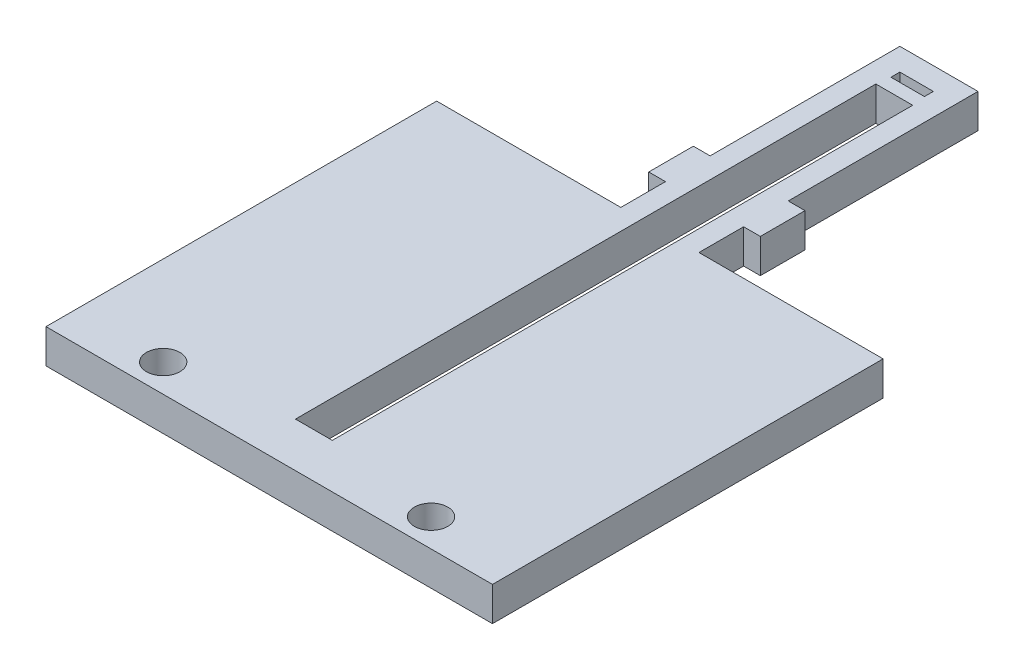
ISO-10303-21;
HEADER;
FILE_DESCRIPTION(('STEP AP214'),'2;1');
FILE_NAME('part.step','',(''),(''),'','','');
FILE_SCHEMA(('AUTOMOTIVE_DESIGN { 1 0 10303 214 1 1 1 1 }'));
ENDSEC;
DATA;
#1=APPLICATION_CONTEXT('core data for automotive mechanical design processes');
#2=APPLICATION_PROTOCOL_DEFINITION('international standard','automotive_design',2000,#1);
#3=PRODUCT_CONTEXT('',#1,'mechanical');
#4=PRODUCT('Part','Part','',(#3));
#5=PRODUCT_RELATED_PRODUCT_CATEGORY('part','',(#4));
#6=PRODUCT_DEFINITION_FORMATION('','',#4);
#7=PRODUCT_DEFINITION_CONTEXT('part definition',#1,'design');
#8=PRODUCT_DEFINITION('design','',#6,#7);
#9=PRODUCT_DEFINITION_SHAPE('','',#8);
#10=(LENGTH_UNIT() NAMED_UNIT(*) SI_UNIT(.MILLI.,.METRE.));
#11=(NAMED_UNIT(*) PLANE_ANGLE_UNIT() SI_UNIT($,.RADIAN.));
#12=(NAMED_UNIT(*) SI_UNIT($,.STERADIAN.) SOLID_ANGLE_UNIT());
#13=UNCERTAINTY_MEASURE_WITH_UNIT(LENGTH_MEASURE(1.E-05),#10,'distance_accuracy_value','');
#14=(GEOMETRIC_REPRESENTATION_CONTEXT(3) GLOBAL_UNCERTAINTY_ASSIGNED_CONTEXT((#13)) GLOBAL_UNIT_ASSIGNED_CONTEXT((#10,
#11,#12)) REPRESENTATION_CONTEXT('',''));
#15=CARTESIAN_POINT('',(0.,0.,0.));
#16=DIRECTION('',(0.,0.,1.));
#17=DIRECTION('',(1.,0.,0.));
#18=AXIS2_PLACEMENT_3D('',#15,#16,#17);
#19=CARTESIAN_POINT('',(0.,3.05,0.));
#20=DIRECTION('',(0.,0.,-1.));
#21=DIRECTION('',(-1.,0.,0.));
#22=AXIS2_PLACEMENT_3D('',#19,#20,#21);
#23=PLANE('',#22);
#24=DIRECTION('',(1.,0.,0.));
#25=VECTOR('',#24,1.);
#26=CARTESIAN_POINT('',(0.,0.,0.));
#27=LINE('',#26,#25);
#28=CARTESIAN_POINT('',(0.,0.,0.));
#29=VERTEX_POINT('',#28);
#30=CARTESIAN_POINT('',(40.,0.,0.));
#31=VERTEX_POINT('',#30);
#32=EDGE_CURVE('E239',#29,#31,#27,.T.);
#33=ORIENTED_EDGE('',*,*,#32,.T.);
#34=DIRECTION('',(0.,-1.,0.));
#35=VECTOR('',#34,1.);
#36=CARTESIAN_POINT('',(40.,3.05,0.));
#37=LINE('',#36,#35);
#38=CARTESIAN_POINT('',(40.,3.05,0.));
#39=VERTEX_POINT('',#38);
#40=EDGE_CURVE('E232',#39,#31,#37,.T.);
#41=ORIENTED_EDGE('',*,*,#40,.F.);
#42=DIRECTION('',(1.,0.,0.));
#43=VECTOR('',#42,1.);
#44=CARTESIAN_POINT('',(0.,3.05,0.));
#45=LINE('',#44,#43);
#46=CARTESIAN_POINT('',(0.,3.05,0.));
#47=VERTEX_POINT('',#46);
#48=EDGE_CURVE('E250',#47,#39,#45,.T.);
#49=ORIENTED_EDGE('',*,*,#48,.F.);
#50=DIRECTION('',(0.,-1.,0.));
#51=VECTOR('',#50,1.);
#52=CARTESIAN_POINT('',(0.,3.05,0.));
#53=LINE('',#52,#51);
#54=EDGE_CURVE('E228',#47,#29,#53,.T.);
#55=ORIENTED_EDGE('',*,*,#54,.T.);
#56=EDGE_LOOP('',(#33,#41,#49,#55));
#57=FACE_BOUND('',#56,.T.);
#58=ADVANCED_FACE('F42',(#57),#23,.F.);
#59=CARTESIAN_POINT('',(40.,3.05,0.));
#60=DIRECTION('',(-1.,0.,0.));
#61=DIRECTION('',(0.,0.,1.));
#62=AXIS2_PLACEMENT_3D('',#59,#60,#61);
#63=PLANE('',#62);
#64=DIRECTION('',(0.,0.,-1.));
#65=VECTOR('',#64,1.);
#66=CARTESIAN_POINT('',(40.,0.,0.));
#67=LINE('',#66,#65);
#68=CARTESIAN_POINT('',(40.,0.,-35.));
#69=VERTEX_POINT('',#68);
#70=EDGE_CURVE('E242',#31,#69,#67,.T.);
#71=ORIENTED_EDGE('',*,*,#70,.T.);
#72=DIRECTION('',(0.,1.,0.));
#73=VECTOR('',#72,1.);
#74=CARTESIAN_POINT('',(40.,-6.95,-35.));
#75=LINE('',#74,#73);
#76=CARTESIAN_POINT('',(40.,3.05,-35.));
#77=VERTEX_POINT('',#76);
#78=EDGE_CURVE('E313',#69,#77,#75,.T.);
#79=ORIENTED_EDGE('',*,*,#78,.T.);
#80=DIRECTION('',(0.,0.,-1.));
#81=VECTOR('',#80,1.);
#82=CARTESIAN_POINT('',(40.,3.05,0.));
#83=LINE('',#82,#81);
#84=EDGE_CURVE('E235',#39,#77,#83,.T.);
#85=ORIENTED_EDGE('',*,*,#84,.F.);
#86=ORIENTED_EDGE('',*,*,#40,.T.);
#87=EDGE_LOOP('',(#71,#79,#85,#86));
#88=FACE_BOUND('',#87,.T.);
#89=ADVANCED_FACE('F417',(#88),#63,.F.);
#90=CARTESIAN_POINT('',(0.,3.05,-60.));
#91=DIRECTION('',(0.,0.,-1.));
#92=DIRECTION('',(-1.,0.,0.));
#93=AXIS2_PLACEMENT_3D('',#90,#91,#92);
#94=PLANE('',#93);
#95=DIRECTION('',(0.,1.,0.));
#96=VECTOR('',#95,1.);
#97=CARTESIAN_POINT('',(16.5,-6.95,-60.));
#98=LINE('',#97,#96);
#99=CARTESIAN_POINT('',(16.5,0.,-60.));
#100=VERTEX_POINT('',#99);
#101=CARTESIAN_POINT('',(16.5,3.05,-60.));
#102=VERTEX_POINT('',#101);
#103=EDGE_CURVE('E333',#100,#102,#98,.T.);
#104=ORIENTED_EDGE('',*,*,#103,.T.);
#105=DIRECTION('',(1.,0.,0.));
#106=VECTOR('',#105,1.);
#107=CARTESIAN_POINT('',(0.,3.05,-60.));
#108=LINE('',#107,#106);
#109=CARTESIAN_POINT('',(23.5,3.05,-60.));
#110=VERTEX_POINT('',#109);
#111=EDGE_CURVE('E230',#102,#110,#108,.T.);
#112=ORIENTED_EDGE('',*,*,#111,.T.);
#113=DIRECTION('',(0.,1.,0.));
#114=VECTOR('',#113,1.);
#115=CARTESIAN_POINT('',(23.5,-6.95,-60.));
#116=LINE('',#115,#114);
#117=CARTESIAN_POINT('',(23.5,0.,-60.));
#118=VERTEX_POINT('',#117);
#119=EDGE_CURVE('E346',#118,#110,#116,.T.);
#120=ORIENTED_EDGE('',*,*,#119,.F.);
#121=DIRECTION('',(1.,0.,0.));
#122=VECTOR('',#121,1.);
#123=CARTESIAN_POINT('',(0.,0.,-60.));
#124=LINE('',#123,#122);
#125=EDGE_CURVE('E246',#100,#118,#124,.T.);
#126=ORIENTED_EDGE('',*,*,#125,.F.);
#127=EDGE_LOOP('',(#104,#112,#120,#126));
#128=FACE_BOUND('',#127,.T.);
#129=ADVANCED_FACE('F443',(#128),#94,.T.);
#130=CARTESIAN_POINT('',(0.,3.05,0.));
#131=DIRECTION('',(-1.,0.,0.));
#132=DIRECTION('',(0.,0.,1.));
#133=AXIS2_PLACEMENT_3D('',#130,#131,#132);
#134=PLANE('',#133);
#135=DIRECTION('',(0.,1.,0.));
#136=VECTOR('',#135,1.);
#137=CARTESIAN_POINT('',(0.,-6.95,-35.));
#138=LINE('',#137,#136);
#139=CARTESIAN_POINT('',(0.,0.,-35.));
#140=VERTEX_POINT('',#139);
#141=CARTESIAN_POINT('',(0.,3.05,-35.));
#142=VERTEX_POINT('',#141);
#143=EDGE_CURVE('E202',#140,#142,#138,.T.);
#144=ORIENTED_EDGE('',*,*,#143,.F.);
#145=DIRECTION('',(0.,0.,-1.));
#146=VECTOR('',#145,1.);
#147=CARTESIAN_POINT('',(0.,0.,0.));
#148=LINE('',#147,#146);
#149=EDGE_CURVE('E249',#29,#140,#148,.T.);
#150=ORIENTED_EDGE('',*,*,#149,.F.);
#151=ORIENTED_EDGE('',*,*,#54,.F.);
#152=DIRECTION('',(0.,0.,-1.));
#153=VECTOR('',#152,1.);
#154=CARTESIAN_POINT('',(0.,3.05,0.));
#155=LINE('',#154,#153);
#156=EDGE_CURVE('E221',#47,#142,#155,.T.);
#157=ORIENTED_EDGE('',*,*,#156,.T.);
#158=EDGE_LOOP('',(#144,#150,#151,#157));
#159=FACE_BOUND('',#158,.T.);
#160=ADVANCED_FACE('F227',(#159),#134,.T.);
#161=CARTESIAN_POINT('',(0.,3.05,0.));
#162=DIRECTION('',(0.,1.,0.));
#163=DIRECTION('',(0.,0.,1.));
#164=AXIS2_PLACEMENT_3D('',#161,#162,#163);
#165=PLANE('',#164);
#166=CARTESIAN_POINT('',(8.,3.05,-2.5));
#167=DIRECTION('',(0.,1.,0.));
#168=DIRECTION('',(0.,0.,1.));
#169=AXIS2_PLACEMENT_3D('',#166,#167,#168);
#170=CIRCLE('',#169,1.5);
#171=CARTESIAN_POINT('',(8.,3.05,-1.));
#172=VERTEX_POINT('',#171);
#173=EDGE_CURVE('E309',#172,#172,#170,.T.);
#174=ORIENTED_EDGE('',*,*,#173,.F.);
#175=EDGE_LOOP('',(#174));
#176=FACE_BOUND('',#175,.T.);
#177=CARTESIAN_POINT('',(32.,3.05,-2.5));
#178=DIRECTION('',(0.,1.,0.));
#179=DIRECTION('',(0.,0.,1.));
#180=AXIS2_PLACEMENT_3D('',#177,#178,#179);
#181=CIRCLE('',#180,1.5);
#182=CARTESIAN_POINT('',(32.,3.05,-0.999999999999996));
#183=VERTEX_POINT('',#182);
#184=EDGE_CURVE('E315',#183,#183,#181,.T.);
#185=ORIENTED_EDGE('',*,*,#184,.F.);
#186=EDGE_LOOP('',(#185));
#187=FACE_BOUND('',#186,.T.);
#188=DIRECTION('',(0.,0.,-1.));
#189=VECTOR('',#188,1.);
#190=CARTESIAN_POINT('',(16.5,3.05,-43.));
#191=LINE('',#190,#189);
#192=CARTESIAN_POINT('',(16.5,3.05,-43.));
#193=VERTEX_POINT('',#192);
#194=EDGE_CURVE('E213',#193,#102,#191,.T.);
#195=ORIENTED_EDGE('',*,*,#194,.F.);
#196=DIRECTION('',(1.,0.,0.));
#197=VECTOR('',#196,1.);
#198=CARTESIAN_POINT('',(15.,3.05,-43.));
#199=LINE('',#198,#197);
#200=CARTESIAN_POINT('',(15.,3.05,-43.));
#201=VERTEX_POINT('',#200);
#202=EDGE_CURVE('E329',#201,#193,#199,.T.);
#203=ORIENTED_EDGE('',*,*,#202,.F.);
#204=DIRECTION('',(0.,0.,-1.));
#205=VECTOR('',#204,1.);
#206=CARTESIAN_POINT('',(15.,3.05,-39.));
#207=LINE('',#206,#205);
#208=CARTESIAN_POINT('',(15.,3.05,-39.));
#209=VERTEX_POINT('',#208);
#210=EDGE_CURVE('E326',#209,#201,#207,.T.);
#211=ORIENTED_EDGE('',*,*,#210,.F.);
#212=DIRECTION('',(-1.,0.,0.));
#213=VECTOR('',#212,1.);
#214=CARTESIAN_POINT('',(16.5,3.05,-39.));
#215=LINE('',#214,#213);
#216=CARTESIAN_POINT('',(16.5,3.05,-39.));
#217=VERTEX_POINT('',#216);
#218=EDGE_CURVE('E323',#217,#209,#215,.T.);
#219=ORIENTED_EDGE('',*,*,#218,.F.);
#220=DIRECTION('',(0.,0.,-1.));
#221=VECTOR('',#220,1.);
#222=CARTESIAN_POINT('',(16.5,3.05,-35.));
#223=LINE('',#222,#221);
#224=CARTESIAN_POINT('',(16.5,3.05,-35.));
#225=VERTEX_POINT('',#224);
#226=EDGE_CURVE('E224',#225,#217,#223,.T.);
#227=ORIENTED_EDGE('',*,*,#226,.F.);
#228=DIRECTION('',(1.,0.,0.));
#229=VECTOR('',#228,1.);
#230=CARTESIAN_POINT('',(0.,3.05,-35.));
#231=LINE('',#230,#229);
#232=EDGE_CURVE('E205',#142,#225,#231,.T.);
#233=ORIENTED_EDGE('',*,*,#232,.F.);
#234=ORIENTED_EDGE('',*,*,#156,.F.);
#235=ORIENTED_EDGE('',*,*,#48,.T.);
#236=ORIENTED_EDGE('',*,*,#84,.T.);
#237=DIRECTION('',(1.,0.,0.));
#238=VECTOR('',#237,1.);
#239=CARTESIAN_POINT('',(23.5,3.05,-35.));
#240=LINE('',#239,#238);
#241=CARTESIAN_POINT('',(23.5,3.05,-35.));
#242=VERTEX_POINT('',#241);
#243=EDGE_CURVE('E348',#242,#77,#240,.T.);
#244=ORIENTED_EDGE('',*,*,#243,.F.);
#245=DIRECTION('',(0.,0.,1.));
#246=VECTOR('',#245,1.);
#247=CARTESIAN_POINT('',(23.5,3.05,-35.));
#248=LINE('',#247,#246);
#249=CARTESIAN_POINT('',(23.5,3.05,-39.));
#250=VERTEX_POINT('',#249);
#251=EDGE_CURVE('E361',#250,#242,#248,.T.);
#252=ORIENTED_EDGE('',*,*,#251,.F.);
#253=DIRECTION('',(-1.,0.,0.));
#254=VECTOR('',#253,1.);
#255=CARTESIAN_POINT('',(23.5,3.05,-39.));
#256=LINE('',#255,#254);
#257=CARTESIAN_POINT('',(25.,3.05,-39.));
#258=VERTEX_POINT('',#257);
#259=EDGE_CURVE('E364',#258,#250,#256,.T.);
#260=ORIENTED_EDGE('',*,*,#259,.F.);
#261=DIRECTION('',(0.,0.,1.));
#262=VECTOR('',#261,1.);
#263=CARTESIAN_POINT('',(25.,3.05,-39.));
#264=LINE('',#263,#262);
#265=CARTESIAN_POINT('',(25.,3.05,-43.));
#266=VERTEX_POINT('',#265);
#267=EDGE_CURVE('E367',#266,#258,#264,.T.);
#268=ORIENTED_EDGE('',*,*,#267,.F.);
#269=DIRECTION('',(1.,0.,0.));
#270=VECTOR('',#269,1.);
#271=CARTESIAN_POINT('',(25.,3.05,-43.));
#272=LINE('',#271,#270);
#273=CARTESIAN_POINT('',(23.5,3.05,-43.));
#274=VERTEX_POINT('',#273);
#275=EDGE_CURVE('E370',#274,#266,#272,.T.);
#276=ORIENTED_EDGE('',*,*,#275,.F.);
#277=DIRECTION('',(0.,0.,1.));
#278=VECTOR('',#277,1.);
#279=CARTESIAN_POINT('',(23.5,3.05,-43.));
#280=LINE('',#279,#278);
#281=EDGE_CURVE('E225',#110,#274,#280,.T.);
#282=ORIENTED_EDGE('',*,*,#281,.F.);
#283=ORIENTED_EDGE('',*,*,#111,.F.);
#284=EDGE_LOOP('',(#195,#203,#211,#219,#227,#233,#234,#235,#236,#244,#252,#260,#268,#276,#282,#283));
#285=FACE_BOUND('',#284,.T.);
#286=DIRECTION('',(1.,0.,0.));
#287=VECTOR('',#286,1.);
#288=CARTESIAN_POINT('',(0.,3.05,-4.));
#289=LINE('',#288,#287);
#290=CARTESIAN_POINT('',(18.35,3.05,-4.));
#291=VERTEX_POINT('',#290);
#292=CARTESIAN_POINT('',(21.65,3.05,-4.));
#293=VERTEX_POINT('',#292);
#294=EDGE_CURVE('E374',#291,#293,#289,.T.);
#295=ORIENTED_EDGE('',*,*,#294,.F.);
#296=DIRECTION('',(0.,0.,1.));
#297=VECTOR('',#296,1.);
#298=CARTESIAN_POINT('',(18.35,3.05,0.));
#299=LINE('',#298,#297);
#300=CARTESIAN_POINT('',(18.35,3.05,-56.));
#301=VERTEX_POINT('',#300);
#302=EDGE_CURVE('E383',#301,#291,#299,.T.);
#303=ORIENTED_EDGE('',*,*,#302,.F.);
#304=DIRECTION('',(-1.,0.,0.));
#305=VECTOR('',#304,1.);
#306=CARTESIAN_POINT('',(0.,3.05,-56.));
#307=LINE('',#306,#305);
#308=CARTESIAN_POINT('',(21.65,3.05,-56.));
#309=VERTEX_POINT('',#308);
#310=EDGE_CURVE('E380',#309,#301,#307,.T.);
#311=ORIENTED_EDGE('',*,*,#310,.F.);
#312=DIRECTION('',(0.,0.,-1.));
#313=VECTOR('',#312,1.);
#314=CARTESIAN_POINT('',(21.65,3.05,0.));
#315=LINE('',#314,#313);
#316=EDGE_CURVE('E376',#293,#309,#315,.T.);
#317=ORIENTED_EDGE('',*,*,#316,.F.);
#318=EDGE_LOOP('',(#295,#303,#311,#317));
#319=FACE_BOUND('',#318,.T.);
#320=DIRECTION('',(1.,0.,0.));
#321=VECTOR('',#320,1.);
#322=CARTESIAN_POINT('',(0.,3.05,-57.2));
#323=LINE('',#322,#321);
#324=CARTESIAN_POINT('',(18.5,3.05,-57.2));
#325=VERTEX_POINT('',#324);
#326=CARTESIAN_POINT('',(21.5,3.05,-57.2));
#327=VERTEX_POINT('',#326);
#328=EDGE_CURVE('E336',#325,#327,#323,.T.);
#329=ORIENTED_EDGE('',*,*,#328,.F.);
#330=DIRECTION('',(0.,0.,1.));
#331=VECTOR('',#330,1.);
#332=CARTESIAN_POINT('',(18.5000000000003,3.05,0.));
#333=LINE('',#332,#331);
#334=CARTESIAN_POINT('',(18.5,3.05,-58.));
#335=VERTEX_POINT('',#334);
#336=EDGE_CURVE('E401',#335,#325,#333,.T.);
#337=ORIENTED_EDGE('',*,*,#336,.F.);
#338=DIRECTION('',(-1.,0.,0.));
#339=VECTOR('',#338,1.);
#340=CARTESIAN_POINT('',(0.,3.05,-58.));
#341=LINE('',#340,#339);
#342=CARTESIAN_POINT('',(21.5,3.05,-58.));
#343=VERTEX_POINT('',#342);
#344=EDGE_CURVE('E398',#343,#335,#341,.T.);
#345=ORIENTED_EDGE('',*,*,#344,.F.);
#346=DIRECTION('',(0.,0.,-1.));
#347=VECTOR('',#346,1.);
#348=CARTESIAN_POINT('',(21.4999999999995,3.05,1.86482773667502E-13));
#349=LINE('',#348,#347);
#350=EDGE_CURVE('E395',#327,#343,#349,.T.);
#351=ORIENTED_EDGE('',*,*,#350,.F.);
#352=EDGE_LOOP('',(#329,#337,#345,#351));
#353=FACE_BOUND('',#352,.T.);
#354=ADVANCED_FACE('F218',(#176,#187,#285,#319,#353),#165,.T.);
#355=CARTESIAN_POINT('',(0.,0.,0.));
#356=DIRECTION('',(0.,1.,0.));
#357=DIRECTION('',(0.,0.,1.));
#358=AXIS2_PLACEMENT_3D('',#355,#356,#357);
#359=PLANE('',#358);
#360=CARTESIAN_POINT('',(8.,0.,-2.5));
#361=DIRECTION('',(0.,1.,0.));
#362=DIRECTION('',(0.,0.,1.));
#363=AXIS2_PLACEMENT_3D('',#360,#361,#362);
#364=CIRCLE('',#363,1.5);
#365=CARTESIAN_POINT('',(8.,0.,-1.));
#366=VERTEX_POINT('',#365);
#367=EDGE_CURVE('E45',#366,#366,#364,.T.);
#368=ORIENTED_EDGE('',*,*,#367,.T.);
#369=EDGE_LOOP('',(#368));
#370=FACE_BOUND('',#369,.T.);
#371=CARTESIAN_POINT('',(32.,0.,-2.5));
#372=DIRECTION('',(0.,1.,0.));
#373=DIRECTION('',(0.,0.,1.));
#374=AXIS2_PLACEMENT_3D('',#371,#372,#373);
#375=CIRCLE('',#374,1.5);
#376=CARTESIAN_POINT('',(32.,0.,-0.999999999999996));
#377=VERTEX_POINT('',#376);
#378=EDGE_CURVE('E307',#377,#377,#375,.T.);
#379=ORIENTED_EDGE('',*,*,#378,.T.);
#380=EDGE_LOOP('',(#379));
#381=FACE_BOUND('',#380,.T.);
#382=DIRECTION('',(0.,0.,1.));
#383=VECTOR('',#382,1.);
#384=CARTESIAN_POINT('',(18.35,0.,0.));
#385=LINE('',#384,#383);
#386=CARTESIAN_POINT('',(18.35,0.,-56.));
#387=VERTEX_POINT('',#386);
#388=CARTESIAN_POINT('',(18.35,0.,-4.));
#389=VERTEX_POINT('',#388);
#390=EDGE_CURVE('E272',#387,#389,#385,.T.);
#391=ORIENTED_EDGE('',*,*,#390,.T.);
#392=DIRECTION('',(1.,0.,0.));
#393=VECTOR('',#392,1.);
#394=CARTESIAN_POINT('',(0.,0.,-4.));
#395=LINE('',#394,#393);
#396=CARTESIAN_POINT('',(21.65,0.,-4.));
#397=VERTEX_POINT('',#396);
#398=EDGE_CURVE('E275',#389,#397,#395,.T.);
#399=ORIENTED_EDGE('',*,*,#398,.T.);
#400=DIRECTION('',(0.,0.,-1.));
#401=VECTOR('',#400,1.);
#402=CARTESIAN_POINT('',(21.65,0.,0.));
#403=LINE('',#402,#401);
#404=CARTESIAN_POINT('',(21.65,0.,-56.));
#405=VERTEX_POINT('',#404);
#406=EDGE_CURVE('E266',#397,#405,#403,.T.);
#407=ORIENTED_EDGE('',*,*,#406,.T.);
#408=DIRECTION('',(-1.,0.,0.));
#409=VECTOR('',#408,1.);
#410=CARTESIAN_POINT('',(0.,0.,-56.));
#411=LINE('',#410,#409);
#412=EDGE_CURVE('E269',#405,#387,#411,.T.);
#413=ORIENTED_EDGE('',*,*,#412,.T.);
#414=EDGE_LOOP('',(#391,#399,#407,#413));
#415=FACE_BOUND('',#414,.T.);
#416=DIRECTION('',(0.,0.,1.));
#417=VECTOR('',#416,1.);
#418=CARTESIAN_POINT('',(18.5000000000003,0.,0.));
#419=LINE('',#418,#417);
#420=CARTESIAN_POINT('',(18.5,0.,-58.));
#421=VERTEX_POINT('',#420);
#422=CARTESIAN_POINT('',(18.5,0.,-57.2));
#423=VERTEX_POINT('',#422);
#424=EDGE_CURVE('E260',#421,#423,#419,.T.);
#425=ORIENTED_EDGE('',*,*,#424,.T.);
#426=DIRECTION('',(1.,0.,0.));
#427=VECTOR('',#426,1.);
#428=CARTESIAN_POINT('',(0.,0.,-57.2));
#429=LINE('',#428,#427);
#430=CARTESIAN_POINT('',(21.5,0.,-57.2));
#431=VERTEX_POINT('',#430);
#432=EDGE_CURVE('E263',#423,#431,#429,.T.);
#433=ORIENTED_EDGE('',*,*,#432,.T.);
#434=DIRECTION('',(0.,0.,-1.));
#435=VECTOR('',#434,1.);
#436=CARTESIAN_POINT('',(21.4999999999995,0.,1.86482773667502E-13));
#437=LINE('',#436,#435);
#438=CARTESIAN_POINT('',(21.5,0.,-58.));
#439=VERTEX_POINT('',#438);
#440=EDGE_CURVE('E254',#431,#439,#437,.T.);
#441=ORIENTED_EDGE('',*,*,#440,.T.);
#442=DIRECTION('',(-1.,0.,0.));
#443=VECTOR('',#442,1.);
#444=CARTESIAN_POINT('',(0.,0.,-58.));
#445=LINE('',#444,#443);
#446=EDGE_CURVE('E257',#439,#421,#445,.T.);
#447=ORIENTED_EDGE('',*,*,#446,.T.);
#448=EDGE_LOOP('',(#425,#433,#441,#447));
#449=FACE_BOUND('',#448,.T.);
#450=DIRECTION('',(1.,0.,0.));
#451=VECTOR('',#450,1.);
#452=CARTESIAN_POINT('',(0.,0.,-43.));
#453=LINE('',#452,#451);
#454=CARTESIAN_POINT('',(15.,0.,-43.));
#455=VERTEX_POINT('',#454);
#456=CARTESIAN_POINT('',(16.5,0.,-43.));
#457=VERTEX_POINT('',#456);
#458=EDGE_CURVE('E50',#455,#457,#453,.T.);
#459=ORIENTED_EDGE('',*,*,#458,.T.);
#460=DIRECTION('',(0.,0.,-1.));
#461=VECTOR('',#460,1.);
#462=CARTESIAN_POINT('',(16.5,0.,0.));
#463=LINE('',#462,#461);
#464=EDGE_CURVE('E11',#457,#100,#463,.T.);
#465=ORIENTED_EDGE('',*,*,#464,.T.);
#466=ORIENTED_EDGE('',*,*,#125,.T.);
#467=DIRECTION('',(0.,0.,1.));
#468=VECTOR('',#467,1.);
#469=CARTESIAN_POINT('',(23.5,0.,0.));
#470=LINE('',#469,#468);
#471=CARTESIAN_POINT('',(23.5,0.,-43.));
#472=VERTEX_POINT('',#471);
#473=EDGE_CURVE('E278',#118,#472,#470,.T.);
#474=ORIENTED_EDGE('',*,*,#473,.T.);
#475=DIRECTION('',(1.,0.,0.));
#476=VECTOR('',#475,1.);
#477=CARTESIAN_POINT('',(0.,0.,-43.));
#478=LINE('',#477,#476);
#479=CARTESIAN_POINT('',(25.,0.,-43.));
#480=VERTEX_POINT('',#479);
#481=EDGE_CURVE('E281',#472,#480,#478,.T.);
#482=ORIENTED_EDGE('',*,*,#481,.T.);
#483=DIRECTION('',(0.,0.,1.));
#484=VECTOR('',#483,1.);
#485=CARTESIAN_POINT('',(25.,0.,0.));
#486=LINE('',#485,#484);
#487=CARTESIAN_POINT('',(25.,0.,-39.));
#488=VERTEX_POINT('',#487);
#489=EDGE_CURVE('E284',#480,#488,#486,.T.);
#490=ORIENTED_EDGE('',*,*,#489,.T.);
#491=DIRECTION('',(-1.,0.,0.));
#492=VECTOR('',#491,1.);
#493=CARTESIAN_POINT('',(0.,0.,-39.));
#494=LINE('',#493,#492);
#495=CARTESIAN_POINT('',(23.5,0.,-39.));
#496=VERTEX_POINT('',#495);
#497=EDGE_CURVE('E287',#488,#496,#494,.T.);
#498=ORIENTED_EDGE('',*,*,#497,.T.);
#499=DIRECTION('',(0.,0.,1.));
#500=VECTOR('',#499,1.);
#501=CARTESIAN_POINT('',(23.5,0.,0.));
#502=LINE('',#501,#500);
#503=CARTESIAN_POINT('',(23.5,0.,-35.));
#504=VERTEX_POINT('',#503);
#505=EDGE_CURVE('E290',#496,#504,#502,.T.);
#506=ORIENTED_EDGE('',*,*,#505,.T.);
#507=DIRECTION('',(1.,0.,0.));
#508=VECTOR('',#507,1.);
#509=CARTESIAN_POINT('',(0.,0.,-35.));
#510=LINE('',#509,#508);
#511=EDGE_CURVE('E293',#504,#69,#510,.T.);
#512=ORIENTED_EDGE('',*,*,#511,.T.);
#513=ORIENTED_EDGE('',*,*,#70,.F.);
#514=ORIENTED_EDGE('',*,*,#32,.F.);
#515=ORIENTED_EDGE('',*,*,#149,.T.);
#516=DIRECTION('',(1.,0.,0.));
#517=VECTOR('',#516,1.);
#518=CARTESIAN_POINT('',(0.,0.,-35.));
#519=LINE('',#518,#517);
#520=CARTESIAN_POINT('',(16.5,0.,-35.));
#521=VERTEX_POINT('',#520);
#522=EDGE_CURVE('E208',#140,#521,#519,.T.);
#523=ORIENTED_EDGE('',*,*,#522,.T.);
#524=DIRECTION('',(0.,0.,-1.));
#525=VECTOR('',#524,1.);
#526=CARTESIAN_POINT('',(16.5,0.,0.));
#527=LINE('',#526,#525);
#528=CARTESIAN_POINT('',(16.5,0.,-39.));
#529=VERTEX_POINT('',#528);
#530=EDGE_CURVE('E297',#521,#529,#527,.T.);
#531=ORIENTED_EDGE('',*,*,#530,.T.);
#532=DIRECTION('',(-1.,0.,0.));
#533=VECTOR('',#532,1.);
#534=CARTESIAN_POINT('',(0.,0.,-39.));
#535=LINE('',#534,#533);
#536=CARTESIAN_POINT('',(15.,0.,-39.));
#537=VERTEX_POINT('',#536);
#538=EDGE_CURVE('E300',#529,#537,#535,.T.);
#539=ORIENTED_EDGE('',*,*,#538,.T.);
#540=DIRECTION('',(0.,0.,-1.));
#541=VECTOR('',#540,1.);
#542=CARTESIAN_POINT('',(15.,0.,0.));
#543=LINE('',#542,#541);
#544=EDGE_CURVE('E303',#537,#455,#543,.T.);
#545=ORIENTED_EDGE('',*,*,#544,.T.);
#546=EDGE_LOOP('',(#459,#465,#466,#474,#482,#490,#498,#506,#512,#513,#514,#515,#523,#531,#539,#545));
#547=FACE_BOUND('',#546,.T.);
#548=ADVANCED_FACE('F422',(#370,#381,#415,#449,#547),#359,.F.);
#549=CARTESIAN_POINT('',(0.,-6.95,-57.2));
#550=DIRECTION('',(0.,0.,1.));
#551=DIRECTION('',(1.,0.,0.));
#552=AXIS2_PLACEMENT_3D('',#549,#550,#551);
#553=PLANE('',#552);
#554=DIRECTION('',(0.,1.,0.));
#555=VECTOR('',#554,1.);
#556=CARTESIAN_POINT('',(18.5,-6.95,-57.2));
#557=LINE('',#556,#555);
#558=EDGE_CURVE('E377',#423,#325,#557,.T.);
#559=ORIENTED_EDGE('',*,*,#558,.T.);
#560=ORIENTED_EDGE('',*,*,#328,.T.);
#561=DIRECTION('',(0.,1.,0.));
#562=VECTOR('',#561,1.);
#563=CARTESIAN_POINT('',(21.5,-6.95,-57.2));
#564=LINE('',#563,#562);
#565=EDGE_CURVE('E404',#431,#327,#564,.T.);
#566=ORIENTED_EDGE('',*,*,#565,.F.);
#567=ORIENTED_EDGE('',*,*,#432,.F.);
#568=EDGE_LOOP('',(#559,#560,#566,#567));
#569=FACE_BOUND('',#568,.T.);
#570=ADVANCED_FACE('F475',(#569),#553,.F.);
#571=CARTESIAN_POINT('',(18.5000000000003,-6.95,0.));
#572=DIRECTION('',(-1.,0.,0.));
#573=DIRECTION('',(0.,0.,1.));
#574=AXIS2_PLACEMENT_3D('',#571,#572,#573);
#575=PLANE('',#574);
#576=DIRECTION('',(0.,1.,0.));
#577=VECTOR('',#576,1.);
#578=CARTESIAN_POINT('',(18.5,-6.95,-58.));
#579=LINE('',#578,#577);
#580=EDGE_CURVE('E406',#421,#335,#579,.T.);
#581=ORIENTED_EDGE('',*,*,#580,.T.);
#582=ORIENTED_EDGE('',*,*,#336,.T.);
#583=ORIENTED_EDGE('',*,*,#558,.F.);
#584=ORIENTED_EDGE('',*,*,#424,.F.);
#585=EDGE_LOOP('',(#581,#582,#583,#584));
#586=FACE_BOUND('',#585,.T.);
#587=ADVANCED_FACE('F482',(#586),#575,.F.);
#588=CARTESIAN_POINT('',(0.,-6.95,-58.));
#589=DIRECTION('',(0.,0.,-1.));
#590=DIRECTION('',(-1.,0.,0.));
#591=AXIS2_PLACEMENT_3D('',#588,#589,#590);
#592=PLANE('',#591);
#593=DIRECTION('',(0.,1.,0.));
#594=VECTOR('',#593,1.);
#595=CARTESIAN_POINT('',(21.5,-6.95,-58.));
#596=LINE('',#595,#594);
#597=EDGE_CURVE('E408',#439,#343,#596,.T.);
#598=ORIENTED_EDGE('',*,*,#597,.T.);
#599=ORIENTED_EDGE('',*,*,#344,.T.);
#600=ORIENTED_EDGE('',*,*,#580,.F.);
#601=ORIENTED_EDGE('',*,*,#446,.F.);
#602=EDGE_LOOP('',(#598,#599,#600,#601));
#603=FACE_BOUND('',#602,.T.);
#604=ADVANCED_FACE('F488',(#603),#592,.F.);
#605=CARTESIAN_POINT('',(21.4999999999995,-6.95,1.86482773667502E-13));
#606=DIRECTION('',(1.,0.,0.));
#607=DIRECTION('',(0.,0.,-1.));
#608=AXIS2_PLACEMENT_3D('',#605,#606,#607);
#609=PLANE('',#608);
#610=ORIENTED_EDGE('',*,*,#565,.T.);
#611=ORIENTED_EDGE('',*,*,#350,.T.);
#612=ORIENTED_EDGE('',*,*,#597,.F.);
#613=ORIENTED_EDGE('',*,*,#440,.F.);
#614=EDGE_LOOP('',(#610,#611,#612,#613));
#615=FACE_BOUND('',#614,.T.);
#616=ADVANCED_FACE('F484',(#615),#609,.F.);
#617=CARTESIAN_POINT('',(0.,-6.95,-4.));
#618=DIRECTION('',(0.,0.,1.));
#619=DIRECTION('',(1.,0.,0.));
#620=AXIS2_PLACEMENT_3D('',#617,#618,#619);
#621=PLANE('',#620);
#622=DIRECTION('',(0.,1.,0.));
#623=VECTOR('',#622,1.);
#624=CARTESIAN_POINT('',(18.35,-6.95,-4.));
#625=LINE('',#624,#623);
#626=EDGE_CURVE('E243',#389,#291,#625,.T.);
#627=ORIENTED_EDGE('',*,*,#626,.T.);
#628=ORIENTED_EDGE('',*,*,#294,.T.);
#629=DIRECTION('',(0.,1.,0.));
#630=VECTOR('',#629,1.);
#631=CARTESIAN_POINT('',(21.65,-6.95,-4.));
#632=LINE('',#631,#630);
#633=EDGE_CURVE('E386',#397,#293,#632,.T.);
#634=ORIENTED_EDGE('',*,*,#633,.F.);
#635=ORIENTED_EDGE('',*,*,#398,.F.);
#636=EDGE_LOOP('',(#627,#628,#634,#635));
#637=FACE_BOUND('',#636,.T.);
#638=ADVANCED_FACE('F487',(#637),#621,.F.);
#639=CARTESIAN_POINT('',(18.35,-6.95,0.));
#640=DIRECTION('',(-1.,0.,0.));
#641=DIRECTION('',(0.,0.,1.));
#642=AXIS2_PLACEMENT_3D('',#639,#640,#641);
#643=PLANE('',#642);
#644=DIRECTION('',(0.,1.,0.));
#645=VECTOR('',#644,1.);
#646=CARTESIAN_POINT('',(18.35,-6.95,-56.));
#647=LINE('',#646,#645);
#648=EDGE_CURVE('E388',#387,#301,#647,.T.);
#649=ORIENTED_EDGE('',*,*,#648,.T.);
#650=ORIENTED_EDGE('',*,*,#302,.T.);
#651=ORIENTED_EDGE('',*,*,#626,.F.);
#652=ORIENTED_EDGE('',*,*,#390,.F.);
#653=EDGE_LOOP('',(#649,#650,#651,#652));
#654=FACE_BOUND('',#653,.T.);
#655=ADVANCED_FACE('F498',(#654),#643,.F.);
#656=CARTESIAN_POINT('',(0.,-6.95,-56.));
#657=DIRECTION('',(0.,0.,-1.));
#658=DIRECTION('',(-1.,0.,0.));
#659=AXIS2_PLACEMENT_3D('',#656,#657,#658);
#660=PLANE('',#659);
#661=DIRECTION('',(0.,1.,0.));
#662=VECTOR('',#661,1.);
#663=CARTESIAN_POINT('',(21.65,-6.95,-56.));
#664=LINE('',#663,#662);
#665=EDGE_CURVE('E390',#405,#309,#664,.T.);
#666=ORIENTED_EDGE('',*,*,#665,.T.);
#667=ORIENTED_EDGE('',*,*,#310,.T.);
#668=ORIENTED_EDGE('',*,*,#648,.F.);
#669=ORIENTED_EDGE('',*,*,#412,.F.);
#670=EDGE_LOOP('',(#666,#667,#668,#669));
#671=FACE_BOUND('',#670,.T.);
#672=ADVANCED_FACE('F503',(#671),#660,.F.);
#673=CARTESIAN_POINT('',(21.65,-6.95,0.));
#674=DIRECTION('',(1.,0.,0.));
#675=DIRECTION('',(0.,0.,-1.));
#676=AXIS2_PLACEMENT_3D('',#673,#674,#675);
#677=PLANE('',#676);
#678=ORIENTED_EDGE('',*,*,#633,.T.);
#679=ORIENTED_EDGE('',*,*,#316,.T.);
#680=ORIENTED_EDGE('',*,*,#665,.F.);
#681=ORIENTED_EDGE('',*,*,#406,.F.);
#682=EDGE_LOOP('',(#678,#679,#680,#681));
#683=FACE_BOUND('',#682,.T.);
#684=ADVANCED_FACE('F500',(#683),#677,.F.);
#685=CARTESIAN_POINT('',(23.5,-6.95,-35.));
#686=DIRECTION('',(0.,0.,1.));
#687=DIRECTION('',(1.,0.,0.));
#688=AXIS2_PLACEMENT_3D('',#685,#686,#687);
#689=PLANE('',#688);
#690=DIRECTION('',(0.,1.,0.));
#691=VECTOR('',#690,1.);
#692=CARTESIAN_POINT('',(23.5,-6.95,-35.));
#693=LINE('',#692,#691);
#694=EDGE_CURVE('E356',#504,#242,#693,.T.);
#695=ORIENTED_EDGE('',*,*,#694,.T.);
#696=ORIENTED_EDGE('',*,*,#243,.T.);
#697=ORIENTED_EDGE('',*,*,#78,.F.);
#698=ORIENTED_EDGE('',*,*,#511,.F.);
#699=EDGE_LOOP('',(#695,#696,#697,#698));
#700=FACE_BOUND('',#699,.T.);
#701=ADVANCED_FACE('F419',(#700),#689,.F.);
#702=CARTESIAN_POINT('',(23.5,-6.95,-35.));
#703=DIRECTION('',(-1.,0.,0.));
#704=DIRECTION('',(0.,0.,1.));
#705=AXIS2_PLACEMENT_3D('',#702,#703,#704);
#706=PLANE('',#705);
#707=DIRECTION('',(0.,1.,0.));
#708=VECTOR('',#707,1.);
#709=CARTESIAN_POINT('',(23.5,-6.95,-39.));
#710=LINE('',#709,#708);
#711=EDGE_CURVE('E354',#496,#250,#710,.T.);
#712=ORIENTED_EDGE('',*,*,#711,.T.);
#713=ORIENTED_EDGE('',*,*,#251,.T.);
#714=ORIENTED_EDGE('',*,*,#694,.F.);
#715=ORIENTED_EDGE('',*,*,#505,.F.);
#716=EDGE_LOOP('',(#712,#713,#714,#715));
#717=FACE_BOUND('',#716,.T.);
#718=ADVANCED_FACE('F426',(#717),#706,.F.);
#719=CARTESIAN_POINT('',(23.5,-6.95,-39.));
#720=DIRECTION('',(0.,0.,-1.));
#721=DIRECTION('',(-1.,0.,0.));
#722=AXIS2_PLACEMENT_3D('',#719,#720,#721);
#723=PLANE('',#722);
#724=DIRECTION('',(0.,1.,0.));
#725=VECTOR('',#724,1.);
#726=CARTESIAN_POINT('',(25.,-6.95,-39.));
#727=LINE('',#726,#725);
#728=EDGE_CURVE('E352',#488,#258,#727,.T.);
#729=ORIENTED_EDGE('',*,*,#728,.T.);
#730=ORIENTED_EDGE('',*,*,#259,.T.);
#731=ORIENTED_EDGE('',*,*,#711,.F.);
#732=ORIENTED_EDGE('',*,*,#497,.F.);
#733=EDGE_LOOP('',(#729,#730,#731,#732));
#734=FACE_BOUND('',#733,.T.);
#735=ADVANCED_FACE('F428',(#734),#723,.F.);
#736=CARTESIAN_POINT('',(25.,-6.95,-39.));
#737=DIRECTION('',(-1.,0.,0.));
#738=DIRECTION('',(0.,0.,1.));
#739=AXIS2_PLACEMENT_3D('',#736,#737,#738);
#740=PLANE('',#739);
#741=DIRECTION('',(0.,1.,0.));
#742=VECTOR('',#741,1.);
#743=CARTESIAN_POINT('',(25.,-6.95,-43.));
#744=LINE('',#743,#742);
#745=EDGE_CURVE('E350',#480,#266,#744,.T.);
#746=ORIENTED_EDGE('',*,*,#745,.T.);
#747=ORIENTED_EDGE('',*,*,#267,.T.);
#748=ORIENTED_EDGE('',*,*,#728,.F.);
#749=ORIENTED_EDGE('',*,*,#489,.F.);
#750=EDGE_LOOP('',(#746,#747,#748,#749));
#751=FACE_BOUND('',#750,.T.);
#752=ADVANCED_FACE('F435',(#751),#740,.F.);
#753=CARTESIAN_POINT('',(25.,-6.95,-43.));
#754=DIRECTION('',(0.,0.,1.));
#755=DIRECTION('',(1.,0.,0.));
#756=AXIS2_PLACEMENT_3D('',#753,#754,#755);
#757=PLANE('',#756);
#758=DIRECTION('',(0.,1.,0.));
#759=VECTOR('',#758,1.);
#760=CARTESIAN_POINT('',(23.5,-6.95,-43.));
#761=LINE('',#760,#759);
#762=EDGE_CURVE('E66',#472,#274,#761,.T.);
#763=ORIENTED_EDGE('',*,*,#762,.T.);
#764=ORIENTED_EDGE('',*,*,#275,.T.);
#765=ORIENTED_EDGE('',*,*,#745,.F.);
#766=ORIENTED_EDGE('',*,*,#481,.F.);
#767=EDGE_LOOP('',(#763,#764,#765,#766));
#768=FACE_BOUND('',#767,.T.);
#769=ADVANCED_FACE('F438',(#768),#757,.F.);
#770=CARTESIAN_POINT('',(23.5,-6.95,-43.));
#771=DIRECTION('',(-1.,0.,0.));
#772=DIRECTION('',(0.,0.,1.));
#773=AXIS2_PLACEMENT_3D('',#770,#771,#772);
#774=PLANE('',#773);
#775=ORIENTED_EDGE('',*,*,#119,.T.);
#776=ORIENTED_EDGE('',*,*,#281,.T.);
#777=ORIENTED_EDGE('',*,*,#762,.F.);
#778=ORIENTED_EDGE('',*,*,#473,.F.);
#779=EDGE_LOOP('',(#775,#776,#777,#778));
#780=FACE_BOUND('',#779,.T.);
#781=ADVANCED_FACE('F439',(#780),#774,.F.);
#782=CARTESIAN_POINT('',(16.5,-6.95,-43.));
#783=DIRECTION('',(1.,0.,0.));
#784=DIRECTION('',(0.,0.,-1.));
#785=AXIS2_PLACEMENT_3D('',#782,#783,#784);
#786=PLANE('',#785);
#787=DIRECTION('',(0.,1.,0.));
#788=VECTOR('',#787,1.);
#789=CARTESIAN_POINT('',(16.5,-6.95,-43.));
#790=LINE('',#789,#788);
#791=EDGE_CURVE('E337',#457,#193,#790,.T.);
#792=ORIENTED_EDGE('',*,*,#791,.T.);
#793=ORIENTED_EDGE('',*,*,#194,.T.);
#794=ORIENTED_EDGE('',*,*,#103,.F.);
#795=ORIENTED_EDGE('',*,*,#464,.F.);
#796=EDGE_LOOP('',(#792,#793,#794,#795));
#797=FACE_BOUND('',#796,.T.);
#798=ADVANCED_FACE('F446',(#797),#786,.F.);
#799=CARTESIAN_POINT('',(15.,-6.95,-43.));
#800=DIRECTION('',(0.,0.,1.));
#801=DIRECTION('',(1.,0.,0.));
#802=AXIS2_PLACEMENT_3D('',#799,#800,#801);
#803=PLANE('',#802);
#804=DIRECTION('',(0.,1.,0.));
#805=VECTOR('',#804,1.);
#806=CARTESIAN_POINT('',(15.,-6.95,-43.));
#807=LINE('',#806,#805);
#808=EDGE_CURVE('E339',#455,#201,#807,.T.);
#809=ORIENTED_EDGE('',*,*,#808,.T.);
#810=ORIENTED_EDGE('',*,*,#202,.T.);
#811=ORIENTED_EDGE('',*,*,#791,.F.);
#812=ORIENTED_EDGE('',*,*,#458,.F.);
#813=EDGE_LOOP('',(#809,#810,#811,#812));
#814=FACE_BOUND('',#813,.T.);
#815=ADVANCED_FACE('F450',(#814),#803,.F.);
#816=CARTESIAN_POINT('',(15.,-6.95,-39.));
#817=DIRECTION('',(1.,0.,0.));
#818=DIRECTION('',(0.,0.,-1.));
#819=AXIS2_PLACEMENT_3D('',#816,#817,#818);
#820=PLANE('',#819);
#821=DIRECTION('',(0.,1.,0.));
#822=VECTOR('',#821,1.);
#823=CARTESIAN_POINT('',(15.,-6.95,-39.));
#824=LINE('',#823,#822);
#825=EDGE_CURVE('E341',#537,#209,#824,.T.);
#826=ORIENTED_EDGE('',*,*,#825,.T.);
#827=ORIENTED_EDGE('',*,*,#210,.T.);
#828=ORIENTED_EDGE('',*,*,#808,.F.);
#829=ORIENTED_EDGE('',*,*,#544,.F.);
#830=EDGE_LOOP('',(#826,#827,#828,#829));
#831=FACE_BOUND('',#830,.T.);
#832=ADVANCED_FACE('F452',(#831),#820,.F.);
#833=CARTESIAN_POINT('',(16.5,-6.95,-39.));
#834=DIRECTION('',(0.,0.,-1.));
#835=DIRECTION('',(-1.,0.,0.));
#836=AXIS2_PLACEMENT_3D('',#833,#834,#835);
#837=PLANE('',#836);
#838=DIRECTION('',(0.,1.,0.));
#839=VECTOR('',#838,1.);
#840=CARTESIAN_POINT('',(16.5,-6.95,-39.));
#841=LINE('',#840,#839);
#842=EDGE_CURVE('E343',#529,#217,#841,.T.);
#843=ORIENTED_EDGE('',*,*,#842,.T.);
#844=ORIENTED_EDGE('',*,*,#218,.T.);
#845=ORIENTED_EDGE('',*,*,#825,.F.);
#846=ORIENTED_EDGE('',*,*,#538,.F.);
#847=EDGE_LOOP('',(#843,#844,#845,#846));
#848=FACE_BOUND('',#847,.T.);
#849=ADVANCED_FACE('F457',(#848),#837,.F.);
#850=CARTESIAN_POINT('',(16.5,-6.95,-35.));
#851=DIRECTION('',(1.,0.,0.));
#852=DIRECTION('',(0.,0.,-1.));
#853=AXIS2_PLACEMENT_3D('',#850,#851,#852);
#854=PLANE('',#853);
#855=DIRECTION('',(0.,1.,0.));
#856=VECTOR('',#855,1.);
#857=CARTESIAN_POINT('',(16.5,-6.95,-35.));
#858=LINE('',#857,#856);
#859=EDGE_CURVE('E58',#521,#225,#858,.T.);
#860=ORIENTED_EDGE('',*,*,#859,.T.);
#861=ORIENTED_EDGE('',*,*,#226,.T.);
#862=ORIENTED_EDGE('',*,*,#842,.F.);
#863=ORIENTED_EDGE('',*,*,#530,.F.);
#864=EDGE_LOOP('',(#860,#861,#862,#863));
#865=FACE_BOUND('',#864,.T.);
#866=ADVANCED_FACE('F460',(#865),#854,.F.);
#867=CARTESIAN_POINT('',(0.,-6.95,-35.));
#868=DIRECTION('',(0.,0.,1.));
#869=DIRECTION('',(1.,0.,0.));
#870=AXIS2_PLACEMENT_3D('',#867,#868,#869);
#871=PLANE('',#870);
#872=ORIENTED_EDGE('',*,*,#143,.T.);
#873=ORIENTED_EDGE('',*,*,#232,.T.);
#874=ORIENTED_EDGE('',*,*,#859,.F.);
#875=ORIENTED_EDGE('',*,*,#522,.F.);
#876=EDGE_LOOP('',(#872,#873,#874,#875));
#877=FACE_BOUND('',#876,.T.);
#878=ADVANCED_FACE('F204',(#877),#871,.F.);
#879=CARTESIAN_POINT('',(32.,-6.95,-2.5));
#880=DIRECTION('',(0.,1.,0.));
#881=DIRECTION('',(0.,0.,1.));
#882=AXIS2_PLACEMENT_3D('',#879,#880,#881);
#883=CYLINDRICAL_SURFACE('',#882,1.5);
#884=ORIENTED_EDGE('',*,*,#184,.T.);
#885=EDGE_LOOP('',(#884));
#886=FACE_BOUND('',#885,.T.);
#887=ORIENTED_EDGE('',*,*,#378,.F.);
#888=EDGE_LOOP('',(#887));
#889=FACE_BOUND('',#888,.T.);
#890=ADVANCED_FACE('F525',(#886,#889),#883,.F.);
#891=CARTESIAN_POINT('',(8.,-6.95,-2.5));
#892=DIRECTION('',(0.,1.,0.));
#893=DIRECTION('',(0.,0.,1.));
#894=AXIS2_PLACEMENT_3D('',#891,#892,#893);
#895=CYLINDRICAL_SURFACE('',#894,1.5);
#896=ORIENTED_EDGE('',*,*,#173,.T.);
#897=EDGE_LOOP('',(#896));
#898=FACE_BOUND('',#897,.T.);
#899=ORIENTED_EDGE('',*,*,#367,.F.);
#900=EDGE_LOOP('',(#899));
#901=FACE_BOUND('',#900,.T.);
#902=ADVANCED_FACE('F538',(#898,#901),#895,.F.);
#903=CLOSED_SHELL('',(#58,#89,#129,#160,#354,#548,#570,#587,#604,#616,#638,#655,#672,#684,#701,
#718,#735,#752,#769,#781,#798,#815,#832,#849,#866,#878,#890,#902));
#904=MANIFOLD_SOLID_BREP('B2',#903);
#905=ADVANCED_BREP_SHAPE_REPRESENTATION('',(#18,#904),#14);
#906=SHAPE_DEFINITION_REPRESENTATION(#9,#905);
ENDSEC;
END-ISO-10303-21;
